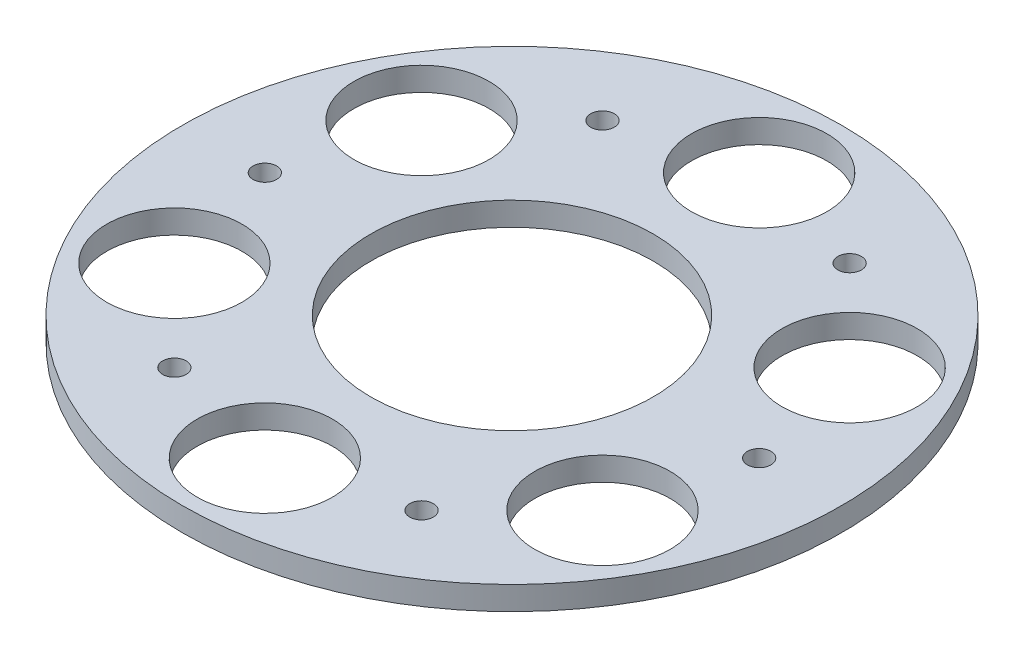
ISO-10303-21;
HEADER;
FILE_DESCRIPTION(('STEP AP214'),'2;1');
FILE_NAME('part.step','',(''),(''),'','','');
FILE_SCHEMA(('AUTOMOTIVE_DESIGN { 1 0 10303 214 1 1 1 1 }'));
ENDSEC;
DATA;
#1=APPLICATION_CONTEXT('core data for automotive mechanical design processes');
#2=APPLICATION_PROTOCOL_DEFINITION('international standard','automotive_design',2000,#1);
#3=PRODUCT_CONTEXT('',#1,'mechanical');
#4=PRODUCT('Part','Part','',(#3));
#5=PRODUCT_RELATED_PRODUCT_CATEGORY('part','',(#4));
#6=PRODUCT_DEFINITION_FORMATION('','',#4);
#7=PRODUCT_DEFINITION_CONTEXT('part definition',#1,'design');
#8=PRODUCT_DEFINITION('design','',#6,#7);
#9=PRODUCT_DEFINITION_SHAPE('','',#8);
#10=(LENGTH_UNIT() NAMED_UNIT(*) SI_UNIT(.MILLI.,.METRE.));
#11=(NAMED_UNIT(*) PLANE_ANGLE_UNIT() SI_UNIT($,.RADIAN.));
#12=(NAMED_UNIT(*) SI_UNIT($,.STERADIAN.) SOLID_ANGLE_UNIT());
#13=UNCERTAINTY_MEASURE_WITH_UNIT(LENGTH_MEASURE(1.E-05),#10,'distance_accuracy_value','');
#14=(GEOMETRIC_REPRESENTATION_CONTEXT(3) GLOBAL_UNCERTAINTY_ASSIGNED_CONTEXT((#13)) GLOBAL_UNIT_ASSIGNED_CONTEXT((#10,
#11,#12)) REPRESENTATION_CONTEXT('',''));
#15=CARTESIAN_POINT('',(0.,0.,0.));
#16=DIRECTION('',(0.,0.,1.));
#17=DIRECTION('',(1.,0.,0.));
#18=AXIS2_PLACEMENT_3D('',#15,#16,#17);
#19=CARTESIAN_POINT('',(0.,2.,0.));
#20=DIRECTION('',(0.,1.,0.));
#21=DIRECTION('',(0.,0.,1.));
#22=AXIS2_PLACEMENT_3D('',#19,#20,#21);
#23=PLANE('',#22);
#24=CARTESIAN_POINT('',(-20.9999999999992,2.,1.32125084115979E-12));
#25=DIRECTION('',(0.,1.,0.));
#26=DIRECTION('',(0.,0.,1.));
#27=AXIS2_PLACEMENT_3D('',#24,#25,#26);
#28=CIRCLE('',#27,1.00000000000161);
#29=CARTESIAN_POINT('',(-20.9999999999992,2.,1.00000000000293));
#30=VERTEX_POINT('',#29);
#31=EDGE_CURVE('E107',#30,#30,#28,.T.);
#32=ORIENTED_EDGE('',*,*,#31,.F.);
#33=EDGE_LOOP('',(#32));
#34=FACE_BOUND('',#33,.T.);
#35=CARTESIAN_POINT('',(10.5000000000015,2.,18.1865334794732));
#36=DIRECTION('',(0.,1.,0.));
#37=DIRECTION('',(0.,0.,1.));
#38=AXIS2_PLACEMENT_3D('',#35,#36,#37);
#39=CIRCLE('',#38,1.00000000000041);
#40=CARTESIAN_POINT('',(10.5000000000015,2.,19.1865334794736));
#41=VERTEX_POINT('',#40);
#42=EDGE_CURVE('E95',#41,#41,#39,.T.);
#43=ORIENTED_EDGE('',*,*,#42,.F.);
#44=EDGE_LOOP('',(#43));
#45=FACE_BOUND('',#44,.T.);
#46=CARTESIAN_POINT('',(0.,2.,0.));
#47=DIRECTION('',(0.,1.,0.));
#48=DIRECTION('',(0.,0.,1.));
#49=AXIS2_PLACEMENT_3D('',#46,#47,#48);
#50=CIRCLE('',#49,12.);
#51=CARTESIAN_POINT('',(0.,2.,12.));
#52=VERTEX_POINT('',#51);
#53=EDGE_CURVE('E83',#52,#52,#50,.T.);
#54=ORIENTED_EDGE('',*,*,#53,.F.);
#55=EDGE_LOOP('',(#54));
#56=FACE_BOUND('',#55,.T.);
#57=CARTESIAN_POINT('',(-18.1865334794719,2.,10.5000000000008));
#58=DIRECTION('',(0.,1.,0.));
#59=DIRECTION('',(0.,0.,1.));
#60=AXIS2_PLACEMENT_3D('',#57,#58,#59);
#61=CIRCLE('',#60,5.7500000000017);
#62=CARTESIAN_POINT('',(-18.1865334794719,2.,16.2500000000025));
#63=VERTEX_POINT('',#62);
#64=EDGE_CURVE('E71',#63,#63,#61,.T.);
#65=ORIENTED_EDGE('',*,*,#64,.F.);
#66=EDGE_LOOP('',(#65));
#67=FACE_BOUND('',#66,.T.);
#68=CARTESIAN_POINT('',(18.1865334794746,2.,10.4999999999992));
#69=DIRECTION('',(0.,1.,0.));
#70=DIRECTION('',(0.,0.,1.));
#71=AXIS2_PLACEMENT_3D('',#68,#69,#70);
#72=CIRCLE('',#71,5.75000000000115);
#73=CARTESIAN_POINT('',(18.1865334794746,2.,16.2500000000004));
#74=VERTEX_POINT('',#73);
#75=EDGE_CURVE('E59',#74,#74,#72,.T.);
#76=ORIENTED_EDGE('',*,*,#75,.F.);
#77=EDGE_LOOP('',(#76));
#78=FACE_BOUND('',#77,.T.);
#79=CARTESIAN_POINT('',(10.5,2.,-18.1865334794732));
#80=DIRECTION('',(0.,1.,0.));
#81=DIRECTION('',(0.,0.,1.));
#82=AXIS2_PLACEMENT_3D('',#79,#80,#81);
#83=CIRCLE('',#82,0.999999999999998);
#84=CARTESIAN_POINT('',(10.5,2.,-17.1865334794732));
#85=VERTEX_POINT('',#84);
#86=EDGE_CURVE('E47',#85,#85,#83,.T.);
#87=ORIENTED_EDGE('',*,*,#86,.F.);
#88=EDGE_LOOP('',(#87));
#89=FACE_BOUND('',#88,.T.);
#90=CARTESIAN_POINT('',(0.,2.,0.));
#91=DIRECTION('',(0.,1.,0.));
#92=DIRECTION('',(0.,0.,1.));
#93=AXIS2_PLACEMENT_3D('',#90,#91,#92);
#94=CIRCLE('',#93,28.);
#95=CARTESIAN_POINT('',(0.,2.,28.));
#96=VERTEX_POINT('',#95);
#97=EDGE_CURVE('E10',#96,#96,#94,.T.);
#98=ORIENTED_EDGE('',*,*,#97,.T.);
#99=EDGE_LOOP('',(#98));
#100=FACE_BOUND('',#99,.T.);
#101=CARTESIAN_POINT('',(0.,2.,-21.));
#102=DIRECTION('',(0.,1.,0.));
#103=DIRECTION('',(0.,0.,1.));
#104=AXIS2_PLACEMENT_3D('',#101,#102,#103);
#105=CIRCLE('',#104,5.75);
#106=CARTESIAN_POINT('',(0.,2.,-15.25));
#107=VERTEX_POINT('',#106);
#108=EDGE_CURVE('E42',#107,#107,#105,.T.);
#109=ORIENTED_EDGE('',*,*,#108,.F.);
#110=EDGE_LOOP('',(#109));
#111=FACE_BOUND('',#110,.T.);
#112=CARTESIAN_POINT('',(18.1865334794737,2.,-10.5000000000008));
#113=DIRECTION('',(0.,1.,0.));
#114=DIRECTION('',(0.,0.,1.));
#115=AXIS2_PLACEMENT_3D('',#112,#113,#114);
#116=CIRCLE('',#115,5.75000000000025);
#117=CARTESIAN_POINT('',(18.1865334794737,2.,-4.75000000000052));
#118=VERTEX_POINT('',#117);
#119=EDGE_CURVE('E53',#118,#118,#116,.T.);
#120=ORIENTED_EDGE('',*,*,#119,.F.);
#121=EDGE_LOOP('',(#120));
#122=FACE_BOUND('',#121,.T.);
#123=CARTESIAN_POINT('',(1.78285241928082E-12,2.,21.));
#124=DIRECTION('',(0.,1.,0.));
#125=DIRECTION('',(0.,0.,1.));
#126=AXIS2_PLACEMENT_3D('',#123,#124,#125);
#127=CIRCLE('',#126,5.75000000000185);
#128=CARTESIAN_POINT('',(1.78285241928082E-12,2.,26.7500000000018));
#129=VERTEX_POINT('',#128);
#130=EDGE_CURVE('E65',#129,#129,#127,.T.);
#131=ORIENTED_EDGE('',*,*,#130,.F.);
#132=EDGE_LOOP('',(#131));
#133=FACE_BOUND('',#132,.T.);
#134=CARTESIAN_POINT('',(-18.1865334794728,2.,-10.4999999999992));
#135=DIRECTION('',(0.,1.,0.));
#136=DIRECTION('',(0.,0.,1.));
#137=AXIS2_PLACEMENT_3D('',#134,#135,#136);
#138=CIRCLE('',#137,5.7500000000009);
#139=CARTESIAN_POINT('',(-18.1865334794728,2.,-4.74999999999832));
#140=VERTEX_POINT('',#139);
#141=EDGE_CURVE('E77',#140,#140,#138,.T.);
#142=ORIENTED_EDGE('',*,*,#141,.F.);
#143=EDGE_LOOP('',(#142));
#144=FACE_BOUND('',#143,.T.);
#145=CARTESIAN_POINT('',(21.0000000000008,2.,-4.2194122565426E-13));
#146=DIRECTION('',(0.,1.,0.));
#147=DIRECTION('',(0.,0.,1.));
#148=AXIS2_PLACEMENT_3D('',#145,#146,#147);
#149=CIRCLE('',#148,0.999999999999771);
#150=CARTESIAN_POINT('',(21.0000000000008,2.,0.999999999999349));
#151=VERTEX_POINT('',#150);
#152=EDGE_CURVE('E89',#151,#151,#149,.T.);
#153=ORIENTED_EDGE('',*,*,#152,.F.);
#154=EDGE_LOOP('',(#153));
#155=FACE_BOUND('',#154,.T.);
#156=CARTESIAN_POINT('',(-10.4999999999985,2.,18.1865334794741));
#157=DIRECTION('',(0.,1.,0.));
#158=DIRECTION('',(0.,0.,1.));
#159=AXIS2_PLACEMENT_3D('',#156,#157,#158);
#160=CIRCLE('',#159,1.00000000000131);
#161=CARTESIAN_POINT('',(-10.4999999999985,2.,19.1865334794754));
#162=VERTEX_POINT('',#161);
#163=EDGE_CURVE('E101',#162,#162,#160,.T.);
#164=ORIENTED_EDGE('',*,*,#163,.F.);
#165=EDGE_LOOP('',(#164));
#166=FACE_BOUND('',#165,.T.);
#167=CARTESIAN_POINT('',(-10.5,2.,-18.1865334794723));
#168=DIRECTION('',(0.,1.,0.));
#169=DIRECTION('',(0.,0.,1.));
#170=AXIS2_PLACEMENT_3D('',#167,#168,#169);
#171=CIRCLE('',#170,1.00000000000105);
#172=CARTESIAN_POINT('',(-10.5,2.,-17.1865334794713));
#173=VERTEX_POINT('',#172);
#174=EDGE_CURVE('E113',#173,#173,#171,.T.);
#175=ORIENTED_EDGE('',*,*,#174,.F.);
#176=EDGE_LOOP('',(#175));
#177=FACE_BOUND('',#176,.T.);
#178=ADVANCED_FACE('F31',(#34,#45,#56,#67,#78,#89,#100,#111,#122,#133,#144,#155,#166,#177),#23,.T.);
#179=CARTESIAN_POINT('',(0.,0.,0.));
#180=DIRECTION('',(0.,1.,0.));
#181=DIRECTION('',(0.,0.,1.));
#182=AXIS2_PLACEMENT_3D('',#179,#180,#181);
#183=PLANE('',#182);
#184=CARTESIAN_POINT('',(0.,0.,0.));
#185=DIRECTION('',(0.,1.,0.));
#186=DIRECTION('',(0.,0.,1.));
#187=AXIS2_PLACEMENT_3D('',#184,#185,#186);
#188=CIRCLE('',#187,28.);
#189=CARTESIAN_POINT('',(0.,0.,28.));
#190=VERTEX_POINT('',#189);
#191=EDGE_CURVE('E35',#190,#190,#188,.T.);
#192=ORIENTED_EDGE('',*,*,#191,.F.);
#193=EDGE_LOOP('',(#192));
#194=FACE_BOUND('',#193,.T.);
#195=CARTESIAN_POINT('',(0.,0.,-21.));
#196=DIRECTION('',(0.,1.,0.));
#197=DIRECTION('',(0.,0.,1.));
#198=AXIS2_PLACEMENT_3D('',#195,#196,#197);
#199=CIRCLE('',#198,5.75);
#200=CARTESIAN_POINT('',(0.,0.,-15.25));
#201=VERTEX_POINT('',#200);
#202=EDGE_CURVE('E44',#201,#201,#199,.T.);
#203=ORIENTED_EDGE('',*,*,#202,.T.);
#204=EDGE_LOOP('',(#203));
#205=FACE_BOUND('',#204,.T.);
#206=CARTESIAN_POINT('',(10.5,0.,-18.1865334794732));
#207=DIRECTION('',(0.,1.,0.));
#208=DIRECTION('',(0.,0.,1.));
#209=AXIS2_PLACEMENT_3D('',#206,#207,#208);
#210=CIRCLE('',#209,0.999999999999998);
#211=CARTESIAN_POINT('',(10.5,0.,-17.1865334794732));
#212=VERTEX_POINT('',#211);
#213=EDGE_CURVE('E50',#212,#212,#210,.T.);
#214=ORIENTED_EDGE('',*,*,#213,.T.);
#215=EDGE_LOOP('',(#214));
#216=FACE_BOUND('',#215,.T.);
#217=CARTESIAN_POINT('',(18.1865334794737,0.,-10.5000000000008));
#218=DIRECTION('',(0.,1.,0.));
#219=DIRECTION('',(0.,0.,1.));
#220=AXIS2_PLACEMENT_3D('',#217,#218,#219);
#221=CIRCLE('',#220,5.75000000000025);
#222=CARTESIAN_POINT('',(18.1865334794737,0.,-4.75000000000052));
#223=VERTEX_POINT('',#222);
#224=EDGE_CURVE('E56',#223,#223,#221,.T.);
#225=ORIENTED_EDGE('',*,*,#224,.T.);
#226=EDGE_LOOP('',(#225));
#227=FACE_BOUND('',#226,.T.);
#228=CARTESIAN_POINT('',(18.1865334794746,0.,10.4999999999992));
#229=DIRECTION('',(0.,1.,0.));
#230=DIRECTION('',(0.,0.,1.));
#231=AXIS2_PLACEMENT_3D('',#228,#229,#230);
#232=CIRCLE('',#231,5.75000000000115);
#233=CARTESIAN_POINT('',(18.1865334794746,0.,16.2500000000004));
#234=VERTEX_POINT('',#233);
#235=EDGE_CURVE('E62',#234,#234,#232,.T.);
#236=ORIENTED_EDGE('',*,*,#235,.T.);
#237=EDGE_LOOP('',(#236));
#238=FACE_BOUND('',#237,.T.);
#239=CARTESIAN_POINT('',(1.78285241928082E-12,0.,21.));
#240=DIRECTION('',(0.,1.,0.));
#241=DIRECTION('',(0.,0.,1.));
#242=AXIS2_PLACEMENT_3D('',#239,#240,#241);
#243=CIRCLE('',#242,5.75000000000185);
#244=CARTESIAN_POINT('',(1.78285241928082E-12,0.,26.7500000000018));
#245=VERTEX_POINT('',#244);
#246=EDGE_CURVE('E68',#245,#245,#243,.T.);
#247=ORIENTED_EDGE('',*,*,#246,.T.);
#248=EDGE_LOOP('',(#247));
#249=FACE_BOUND('',#248,.T.);
#250=CARTESIAN_POINT('',(-18.1865334794719,0.,10.5000000000008));
#251=DIRECTION('',(0.,1.,0.));
#252=DIRECTION('',(0.,0.,1.));
#253=AXIS2_PLACEMENT_3D('',#250,#251,#252);
#254=CIRCLE('',#253,5.7500000000017);
#255=CARTESIAN_POINT('',(-18.1865334794719,0.,16.2500000000025));
#256=VERTEX_POINT('',#255);
#257=EDGE_CURVE('E74',#256,#256,#254,.T.);
#258=ORIENTED_EDGE('',*,*,#257,.T.);
#259=EDGE_LOOP('',(#258));
#260=FACE_BOUND('',#259,.T.);
#261=CARTESIAN_POINT('',(-18.1865334794728,0.,-10.4999999999992));
#262=DIRECTION('',(0.,1.,0.));
#263=DIRECTION('',(0.,0.,1.));
#264=AXIS2_PLACEMENT_3D('',#261,#262,#263);
#265=CIRCLE('',#264,5.7500000000009);
#266=CARTESIAN_POINT('',(-18.1865334794728,0.,-4.74999999999832));
#267=VERTEX_POINT('',#266);
#268=EDGE_CURVE('E80',#267,#267,#265,.T.);
#269=ORIENTED_EDGE('',*,*,#268,.T.);
#270=EDGE_LOOP('',(#269));
#271=FACE_BOUND('',#270,.T.);
#272=CARTESIAN_POINT('',(0.,0.,0.));
#273=DIRECTION('',(0.,1.,0.));
#274=DIRECTION('',(0.,0.,1.));
#275=AXIS2_PLACEMENT_3D('',#272,#273,#274);
#276=CIRCLE('',#275,12.);
#277=CARTESIAN_POINT('',(0.,0.,12.));
#278=VERTEX_POINT('',#277);
#279=EDGE_CURVE('E86',#278,#278,#276,.T.);
#280=ORIENTED_EDGE('',*,*,#279,.T.);
#281=EDGE_LOOP('',(#280));
#282=FACE_BOUND('',#281,.T.);
#283=CARTESIAN_POINT('',(21.0000000000008,0.,-4.2194122565426E-13));
#284=DIRECTION('',(0.,1.,0.));
#285=DIRECTION('',(0.,0.,1.));
#286=AXIS2_PLACEMENT_3D('',#283,#284,#285);
#287=CIRCLE('',#286,0.999999999999771);
#288=CARTESIAN_POINT('',(21.0000000000008,0.,0.999999999999349));
#289=VERTEX_POINT('',#288);
#290=EDGE_CURVE('E92',#289,#289,#287,.T.);
#291=ORIENTED_EDGE('',*,*,#290,.T.);
#292=EDGE_LOOP('',(#291));
#293=FACE_BOUND('',#292,.T.);
#294=CARTESIAN_POINT('',(10.5000000000015,0.,18.1865334794732));
#295=DIRECTION('',(0.,1.,0.));
#296=DIRECTION('',(0.,0.,1.));
#297=AXIS2_PLACEMENT_3D('',#294,#295,#296);
#298=CIRCLE('',#297,1.00000000000041);
#299=CARTESIAN_POINT('',(10.5000000000015,0.,19.1865334794736));
#300=VERTEX_POINT('',#299);
#301=EDGE_CURVE('E98',#300,#300,#298,.T.);
#302=ORIENTED_EDGE('',*,*,#301,.T.);
#303=EDGE_LOOP('',(#302));
#304=FACE_BOUND('',#303,.T.);
#305=CARTESIAN_POINT('',(-10.4999999999985,0.,18.1865334794741));
#306=DIRECTION('',(0.,1.,0.));
#307=DIRECTION('',(0.,0.,1.));
#308=AXIS2_PLACEMENT_3D('',#305,#306,#307);
#309=CIRCLE('',#308,1.00000000000131);
#310=CARTESIAN_POINT('',(-10.4999999999985,0.,19.1865334794754));
#311=VERTEX_POINT('',#310);
#312=EDGE_CURVE('E104',#311,#311,#309,.T.);
#313=ORIENTED_EDGE('',*,*,#312,.T.);
#314=EDGE_LOOP('',(#313));
#315=FACE_BOUND('',#314,.T.);
#316=CARTESIAN_POINT('',(-20.9999999999992,0.,1.32125084115979E-12));
#317=DIRECTION('',(0.,1.,0.));
#318=DIRECTION('',(0.,0.,1.));
#319=AXIS2_PLACEMENT_3D('',#316,#317,#318);
#320=CIRCLE('',#319,1.00000000000161);
#321=CARTESIAN_POINT('',(-20.9999999999992,0.,1.00000000000293));
#322=VERTEX_POINT('',#321);
#323=EDGE_CURVE('E110',#322,#322,#320,.T.);
#324=ORIENTED_EDGE('',*,*,#323,.T.);
#325=EDGE_LOOP('',(#324));
#326=FACE_BOUND('',#325,.T.);
#327=CARTESIAN_POINT('',(-10.5,0.,-18.1865334794723));
#328=DIRECTION('',(0.,1.,0.));
#329=DIRECTION('',(0.,0.,1.));
#330=AXIS2_PLACEMENT_3D('',#327,#328,#329);
#331=CIRCLE('',#330,1.00000000000105);
#332=CARTESIAN_POINT('',(-10.5,0.,-17.1865334794713));
#333=VERTEX_POINT('',#332);
#334=EDGE_CURVE('E116',#333,#333,#331,.T.);
#335=ORIENTED_EDGE('',*,*,#334,.T.);
#336=EDGE_LOOP('',(#335));
#337=FACE_BOUND('',#336,.T.);
#338=ADVANCED_FACE('F126',(#194,#205,#216,#227,#238,#249,#260,#271,#282,#293,#304,#315,#326,
#337),#183,.F.);
#339=CARTESIAN_POINT('',(0.,2.,0.));
#340=DIRECTION('',(0.,-1.,0.));
#341=DIRECTION('',(0.,0.,-1.));
#342=AXIS2_PLACEMENT_3D('',#339,#340,#341);
#343=CYLINDRICAL_SURFACE('',#342,28.);
#344=ORIENTED_EDGE('',*,*,#97,.F.);
#345=EDGE_LOOP('',(#344));
#346=FACE_BOUND('',#345,.T.);
#347=ORIENTED_EDGE('',*,*,#191,.T.);
#348=EDGE_LOOP('',(#347));
#349=FACE_BOUND('',#348,.T.);
#350=ADVANCED_FACE('F33',(#346,#349),#343,.T.);
#351=CARTESIAN_POINT('',(0.,2.,-21.));
#352=DIRECTION('',(0.,-1.,0.));
#353=DIRECTION('',(0.,0.,-1.));
#354=AXIS2_PLACEMENT_3D('',#351,#352,#353);
#355=CYLINDRICAL_SURFACE('',#354,5.75);
#356=ORIENTED_EDGE('',*,*,#108,.T.);
#357=EDGE_LOOP('',(#356));
#358=FACE_BOUND('',#357,.T.);
#359=ORIENTED_EDGE('',*,*,#202,.F.);
#360=EDGE_LOOP('',(#359));
#361=FACE_BOUND('',#360,.T.);
#362=ADVANCED_FACE('F136',(#358,#361),#355,.F.);
#363=CARTESIAN_POINT('',(10.5,2.,-18.1865334794732));
#364=DIRECTION('',(0.,-1.,0.));
#365=DIRECTION('',(0.,0.,-1.));
#366=AXIS2_PLACEMENT_3D('',#363,#364,#365);
#367=CYLINDRICAL_SURFACE('',#366,0.999999999999998);
#368=ORIENTED_EDGE('',*,*,#86,.T.);
#369=EDGE_LOOP('',(#368));
#370=FACE_BOUND('',#369,.T.);
#371=ORIENTED_EDGE('',*,*,#213,.F.);
#372=EDGE_LOOP('',(#371));
#373=FACE_BOUND('',#372,.T.);
#374=ADVANCED_FACE('F139',(#370,#373),#367,.F.);
#375=CARTESIAN_POINT('',(18.1865334794737,2.,-10.5000000000008));
#376=DIRECTION('',(0.,-1.,0.));
#377=DIRECTION('',(0.,0.,-1.));
#378=AXIS2_PLACEMENT_3D('',#375,#376,#377);
#379=CYLINDRICAL_SURFACE('',#378,5.75000000000025);
#380=ORIENTED_EDGE('',*,*,#119,.T.);
#381=EDGE_LOOP('',(#380));
#382=FACE_BOUND('',#381,.T.);
#383=ORIENTED_EDGE('',*,*,#224,.F.);
#384=EDGE_LOOP('',(#383));
#385=FACE_BOUND('',#384,.T.);
#386=ADVANCED_FACE('F143',(#382,#385),#379,.F.);
#387=CARTESIAN_POINT('',(18.1865334794746,2.,10.4999999999992));
#388=DIRECTION('',(0.,-1.,0.));
#389=DIRECTION('',(0.,0.,-1.));
#390=AXIS2_PLACEMENT_3D('',#387,#388,#389);
#391=CYLINDRICAL_SURFACE('',#390,5.75000000000115);
#392=ORIENTED_EDGE('',*,*,#75,.T.);
#393=EDGE_LOOP('',(#392));
#394=FACE_BOUND('',#393,.T.);
#395=ORIENTED_EDGE('',*,*,#235,.F.);
#396=EDGE_LOOP('',(#395));
#397=FACE_BOUND('',#396,.T.);
#398=ADVANCED_FACE('F147',(#394,#397),#391,.F.);
#399=CARTESIAN_POINT('',(1.78285241928082E-12,2.,21.));
#400=DIRECTION('',(0.,-1.,0.));
#401=DIRECTION('',(0.,0.,-1.));
#402=AXIS2_PLACEMENT_3D('',#399,#400,#401);
#403=CYLINDRICAL_SURFACE('',#402,5.75000000000185);
#404=ORIENTED_EDGE('',*,*,#130,.T.);
#405=EDGE_LOOP('',(#404));
#406=FACE_BOUND('',#405,.T.);
#407=ORIENTED_EDGE('',*,*,#246,.F.);
#408=EDGE_LOOP('',(#407));
#409=FACE_BOUND('',#408,.T.);
#410=ADVANCED_FACE('F151',(#406,#409),#403,.F.);
#411=CARTESIAN_POINT('',(-18.1865334794719,2.,10.5000000000008));
#412=DIRECTION('',(0.,-1.,0.));
#413=DIRECTION('',(0.,0.,-1.));
#414=AXIS2_PLACEMENT_3D('',#411,#412,#413);
#415=CYLINDRICAL_SURFACE('',#414,5.7500000000017);
#416=ORIENTED_EDGE('',*,*,#64,.T.);
#417=EDGE_LOOP('',(#416));
#418=FACE_BOUND('',#417,.T.);
#419=ORIENTED_EDGE('',*,*,#257,.F.);
#420=EDGE_LOOP('',(#419));
#421=FACE_BOUND('',#420,.T.);
#422=ADVANCED_FACE('F155',(#418,#421),#415,.F.);
#423=CARTESIAN_POINT('',(-18.1865334794728,2.,-10.4999999999992));
#424=DIRECTION('',(0.,-1.,0.));
#425=DIRECTION('',(0.,0.,-1.));
#426=AXIS2_PLACEMENT_3D('',#423,#424,#425);
#427=CYLINDRICAL_SURFACE('',#426,5.7500000000009);
#428=ORIENTED_EDGE('',*,*,#141,.T.);
#429=EDGE_LOOP('',(#428));
#430=FACE_BOUND('',#429,.T.);
#431=ORIENTED_EDGE('',*,*,#268,.F.);
#432=EDGE_LOOP('',(#431));
#433=FACE_BOUND('',#432,.T.);
#434=ADVANCED_FACE('F159',(#430,#433),#427,.F.);
#435=CARTESIAN_POINT('',(0.,2.,0.));
#436=DIRECTION('',(0.,-1.,0.));
#437=DIRECTION('',(0.,0.,-1.));
#438=AXIS2_PLACEMENT_3D('',#435,#436,#437);
#439=CYLINDRICAL_SURFACE('',#438,12.);
#440=ORIENTED_EDGE('',*,*,#53,.T.);
#441=EDGE_LOOP('',(#440));
#442=FACE_BOUND('',#441,.T.);
#443=ORIENTED_EDGE('',*,*,#279,.F.);
#444=EDGE_LOOP('',(#443));
#445=FACE_BOUND('',#444,.T.);
#446=ADVANCED_FACE('F163',(#442,#445),#439,.F.);
#447=CARTESIAN_POINT('',(21.0000000000008,2.,-4.2194122565426E-13));
#448=DIRECTION('',(0.,-1.,0.));
#449=DIRECTION('',(0.,0.,-1.));
#450=AXIS2_PLACEMENT_3D('',#447,#448,#449);
#451=CYLINDRICAL_SURFACE('',#450,0.999999999999771);
#452=ORIENTED_EDGE('',*,*,#152,.T.);
#453=EDGE_LOOP('',(#452));
#454=FACE_BOUND('',#453,.T.);
#455=ORIENTED_EDGE('',*,*,#290,.F.);
#456=EDGE_LOOP('',(#455));
#457=FACE_BOUND('',#456,.T.);
#458=ADVANCED_FACE('F167',(#454,#457),#451,.F.);
#459=CARTESIAN_POINT('',(10.5000000000015,2.,18.1865334794732));
#460=DIRECTION('',(0.,-1.,0.));
#461=DIRECTION('',(0.,0.,-1.));
#462=AXIS2_PLACEMENT_3D('',#459,#460,#461);
#463=CYLINDRICAL_SURFACE('',#462,1.00000000000041);
#464=ORIENTED_EDGE('',*,*,#42,.T.);
#465=EDGE_LOOP('',(#464));
#466=FACE_BOUND('',#465,.T.);
#467=ORIENTED_EDGE('',*,*,#301,.F.);
#468=EDGE_LOOP('',(#467));
#469=FACE_BOUND('',#468,.T.);
#470=ADVANCED_FACE('F171',(#466,#469),#463,.F.);
#471=CARTESIAN_POINT('',(-10.4999999999985,2.,18.1865334794741));
#472=DIRECTION('',(0.,-1.,0.));
#473=DIRECTION('',(0.,0.,-1.));
#474=AXIS2_PLACEMENT_3D('',#471,#472,#473);
#475=CYLINDRICAL_SURFACE('',#474,1.00000000000131);
#476=ORIENTED_EDGE('',*,*,#163,.T.);
#477=EDGE_LOOP('',(#476));
#478=FACE_BOUND('',#477,.T.);
#479=ORIENTED_EDGE('',*,*,#312,.F.);
#480=EDGE_LOOP('',(#479));
#481=FACE_BOUND('',#480,.T.);
#482=ADVANCED_FACE('F175',(#478,#481),#475,.F.);
#483=CARTESIAN_POINT('',(-20.9999999999992,2.,1.32125084115979E-12));
#484=DIRECTION('',(0.,-1.,0.));
#485=DIRECTION('',(0.,0.,-1.));
#486=AXIS2_PLACEMENT_3D('',#483,#484,#485);
#487=CYLINDRICAL_SURFACE('',#486,1.00000000000161);
#488=ORIENTED_EDGE('',*,*,#31,.T.);
#489=EDGE_LOOP('',(#488));
#490=FACE_BOUND('',#489,.T.);
#491=ORIENTED_EDGE('',*,*,#323,.F.);
#492=EDGE_LOOP('',(#491));
#493=FACE_BOUND('',#492,.T.);
#494=ADVANCED_FACE('F179',(#490,#493),#487,.F.);
#495=CARTESIAN_POINT('',(-10.5,2.,-18.1865334794723));
#496=DIRECTION('',(0.,-1.,0.));
#497=DIRECTION('',(0.,0.,-1.));
#498=AXIS2_PLACEMENT_3D('',#495,#496,#497);
#499=CYLINDRICAL_SURFACE('',#498,1.00000000000105);
#500=ORIENTED_EDGE('',*,*,#174,.T.);
#501=EDGE_LOOP('',(#500));
#502=FACE_BOUND('',#501,.T.);
#503=ORIENTED_EDGE('',*,*,#334,.F.);
#504=EDGE_LOOP('',(#503));
#505=FACE_BOUND('',#504,.T.);
#506=ADVANCED_FACE('F122',(#502,#505),#499,.F.);
#507=CLOSED_SHELL('',(#178,#338,#350,#362,#374,#386,#398,#410,#422,#434,#446,#458,#470,#482,
#494,#506));
#508=MANIFOLD_SOLID_BREP('B2',#507);
#509=ADVANCED_BREP_SHAPE_REPRESENTATION('',(#18,#508),#14);
#510=SHAPE_DEFINITION_REPRESENTATION(#9,#509);
ENDSEC;
END-ISO-10303-21;
